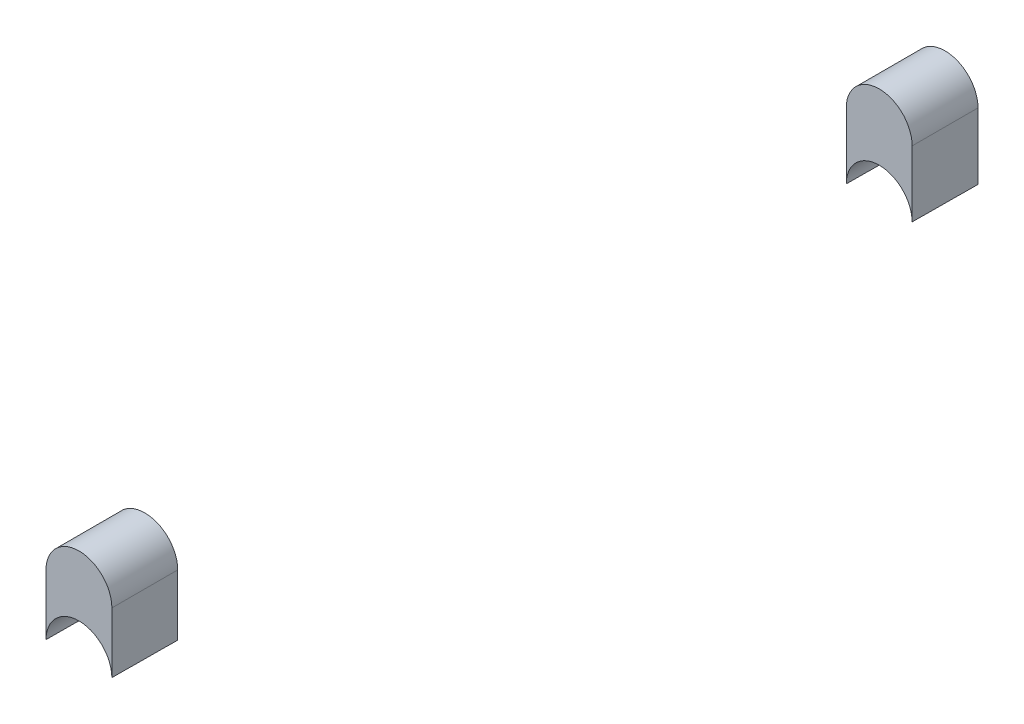
ISO-10303-21;
HEADER;
FILE_DESCRIPTION(('STEP AP214'),'2;1');
FILE_NAME('part.step','',(''),(''),'','','');
FILE_SCHEMA(('AUTOMOTIVE_DESIGN { 1 0 10303 214 1 1 1 1 }'));
ENDSEC;
DATA;
#1=APPLICATION_CONTEXT('core data for automotive mechanical design processes');
#2=APPLICATION_PROTOCOL_DEFINITION('international standard','automotive_design',2000,#1);
#3=PRODUCT_CONTEXT('',#1,'mechanical');
#4=PRODUCT('Part','Part','',(#3));
#5=PRODUCT_RELATED_PRODUCT_CATEGORY('part','',(#4));
#6=PRODUCT_DEFINITION_FORMATION('','',#4);
#7=PRODUCT_DEFINITION_CONTEXT('part definition',#1,'design');
#8=PRODUCT_DEFINITION('design','',#6,#7);
#9=PRODUCT_DEFINITION_SHAPE('','',#8);
#10=(LENGTH_UNIT() NAMED_UNIT(*) SI_UNIT(.MILLI.,.METRE.));
#11=(NAMED_UNIT(*) PLANE_ANGLE_UNIT() SI_UNIT($,.RADIAN.));
#12=(NAMED_UNIT(*) SI_UNIT($,.STERADIAN.) SOLID_ANGLE_UNIT());
#13=UNCERTAINTY_MEASURE_WITH_UNIT(LENGTH_MEASURE(1.E-05),#10,'distance_accuracy_value','');
#14=(GEOMETRIC_REPRESENTATION_CONTEXT(3) GLOBAL_UNCERTAINTY_ASSIGNED_CONTEXT((#13)) GLOBAL_UNIT_ASSIGNED_CONTEXT((#10,
#11,#12)) REPRESENTATION_CONTEXT('',''));
#15=CARTESIAN_POINT('',(0.,0.,0.));
#16=DIRECTION('',(0.,0.,1.));
#17=DIRECTION('',(1.,0.,0.));
#18=AXIS2_PLACEMENT_3D('',#15,#16,#17);
#19=CARTESIAN_POINT('',(0.,50.,-65.75));
#20=DIRECTION('',(0.,0.,1.));
#21=DIRECTION('',(1.,0.,0.));
#22=AXIS2_PLACEMENT_3D('',#19,#20,#21);
#23=CYLINDRICAL_SURFACE('',#22,5.);
#24=CARTESIAN_POINT('',(0.,50.,55.75));
#25=DIRECTION('',(0.,0.,1.));
#26=DIRECTION('',(1.,0.,0.));
#27=AXIS2_PLACEMENT_3D('',#24,#25,#26);
#28=CIRCLE('',#27,5.);
#29=CARTESIAN_POINT('',(-5.,50.,55.75));
#30=VERTEX_POINT('',#29);
#31=CARTESIAN_POINT('',(5.,50.,55.75));
#32=VERTEX_POINT('',#31);
#33=EDGE_CURVE('E52',#30,#32,#28,.F.);
#34=ORIENTED_EDGE('',*,*,#33,.F.);
#35=DIRECTION('',(0.,0.,1.));
#36=VECTOR('',#35,1.);
#37=CARTESIAN_POINT('',(-5.,50.,-65.75));
#38=LINE('',#37,#36);
#39=CARTESIAN_POINT('',(-5.,50.,65.75));
#40=VERTEX_POINT('',#39);
#41=EDGE_CURVE('E94',#30,#40,#38,.T.);
#42=ORIENTED_EDGE('',*,*,#41,.T.);
#43=CARTESIAN_POINT('',(0.,50.,65.75));
#44=DIRECTION('',(0.,0.,1.));
#45=DIRECTION('',(1.,0.,0.));
#46=AXIS2_PLACEMENT_3D('',#43,#44,#45);
#47=CIRCLE('',#46,5.);
#48=CARTESIAN_POINT('',(5.,50.,65.75));
#49=VERTEX_POINT('',#48);
#50=EDGE_CURVE('E83',#49,#40,#47,.T.);
#51=ORIENTED_EDGE('',*,*,#50,.F.);
#52=DIRECTION('',(0.,0.,1.));
#53=VECTOR('',#52,1.);
#54=CARTESIAN_POINT('',(5.,50.,-65.75));
#55=LINE('',#54,#53);
#56=EDGE_CURVE('E89',#32,#49,#55,.T.);
#57=ORIENTED_EDGE('',*,*,#56,.F.);
#58=EDGE_LOOP('',(#34,#42,#51,#57));
#59=FACE_BOUND('',#58,.T.);
#60=ADVANCED_FACE('F43',(#59),#23,.T.);
#61=CARTESIAN_POINT('',(5.,0.,-65.75));
#62=DIRECTION('',(1.,0.,0.));
#63=DIRECTION('',(0.,0.,-1.));
#64=AXIS2_PLACEMENT_3D('',#61,#62,#63);
#65=PLANE('',#64);
#66=DIRECTION('',(0.,-1.,0.));
#67=VECTOR('',#66,1.);
#68=CARTESIAN_POINT('',(5.,55.,55.75));
#69=LINE('',#68,#67);
#70=CARTESIAN_POINT('',(5.,40.7656623645698,55.75));
#71=VERTEX_POINT('',#70);
#72=EDGE_CURVE('E12',#32,#71,#69,.T.);
#73=ORIENTED_EDGE('',*,*,#72,.F.);
#74=ORIENTED_EDGE('',*,*,#56,.T.);
#75=DIRECTION('',(0.,1.,0.));
#76=VECTOR('',#75,1.);
#77=CARTESIAN_POINT('',(5.,0.,65.75));
#78=LINE('',#77,#76);
#79=CARTESIAN_POINT('',(5.,40.8341034292086,65.75));
#80=VERTEX_POINT('',#79);
#81=EDGE_CURVE('E106',#80,#49,#78,.T.);
#82=ORIENTED_EDGE('',*,*,#81,.F.);
#83=DIRECTION('',(0.,0.00684394617439934,0.999976579926131));
#84=VECTOR('',#83,1.);
#85=CARTESIAN_POINT('',(5.,39.9296583512409,-66.3994752808352));
#86=LINE('',#85,#84);
#87=EDGE_CURVE('E91',#71,#80,#86,.T.);
#88=ORIENTED_EDGE('',*,*,#87,.F.);
#89=EDGE_LOOP('',(#73,#74,#82,#88));
#90=FACE_BOUND('',#89,.T.);
#91=ADVANCED_FACE('F87',(#90),#65,.T.);
#92=CARTESIAN_POINT('',(-5.,0.,-65.75));
#93=DIRECTION('',(1.,0.,0.));
#94=DIRECTION('',(0.,0.,-1.));
#95=AXIS2_PLACEMENT_3D('',#92,#93,#94);
#96=PLANE('',#95);
#97=ORIENTED_EDGE('',*,*,#41,.F.);
#98=DIRECTION('',(0.,-1.,0.));
#99=VECTOR('',#98,1.);
#100=CARTESIAN_POINT('',(-5.,55.,55.75));
#101=LINE('',#100,#99);
#102=CARTESIAN_POINT('',(-5.,40.7656623645698,55.75));
#103=VERTEX_POINT('',#102);
#104=EDGE_CURVE('E60',#30,#103,#101,.T.);
#105=ORIENTED_EDGE('',*,*,#104,.T.);
#106=DIRECTION('',(0.,0.00684394617439934,0.999976579926131));
#107=VECTOR('',#106,1.);
#108=CARTESIAN_POINT('',(-5.,39.9296583512409,-66.3994752808352));
#109=LINE('',#108,#107);
#110=CARTESIAN_POINT('',(-5.,40.8341034292086,65.75));
#111=VERTEX_POINT('',#110);
#112=EDGE_CURVE('E96',#103,#111,#109,.T.);
#113=ORIENTED_EDGE('',*,*,#112,.T.);
#114=DIRECTION('',(0.,1.,0.));
#115=VECTOR('',#114,1.);
#116=CARTESIAN_POINT('',(-5.,0.,65.75));
#117=LINE('',#116,#115);
#118=EDGE_CURVE('E100',#111,#40,#117,.T.);
#119=ORIENTED_EDGE('',*,*,#118,.T.);
#120=EDGE_LOOP('',(#97,#105,#113,#119));
#121=FACE_BOUND('',#120,.T.);
#122=ADVANCED_FACE('F131',(#121),#96,.F.);
#123=CARTESIAN_POINT('',(0.,39.8954378189204,-66.3994752808352));
#124=DIRECTION('',(0.,0.,1.));
#125=DIRECTION('',(1.,0.,0.));
#126=AXIS2_PLACEMENT_3D('',#123,#124,#125);
#127=CIRCLE('',#126,5.00011710311191);
#128=DIRECTION('',(0.,0.00684394617439934,0.999976579926131));
#129=VECTOR('',#128,1.);
#130=SURFACE_OF_LINEAR_EXTRUSION('',#127,#129);
#131=ORIENTED_EDGE('',*,*,#112,.F.);
#132=CARTESIAN_POINT('',(-5.,40.7656623645698,55.75));
#133=CARTESIAN_POINT('',(-4.9990659214722,40.90422313923,55.75));
#134=CARTESIAN_POINT('',(-4.99234424224133,41.0427422421989,55.75));
#135=CARTESIAN_POINT('',(-4.96743511855729,41.3187399238017,55.75));
#136=CARTESIAN_POINT('',(-4.94924817199472,41.4562185473572,55.75));
#137=CARTESIAN_POINT('',(-4.90151719276049,41.7291940453299,55.75));
#138=CARTESIAN_POINT('',(-4.87197284743892,41.8646908650849,55.75));
#139=CARTESIAN_POINT('',(-4.80173606304755,42.1327618149604,55.75));
#140=CARTESIAN_POINT('',(-4.76104375369362,42.2653359790691,55.75));
#141=CARTESIAN_POINT('',(-4.66879879488905,42.5266246879324,55.75));
#142=CARTESIAN_POINT('',(-4.61724803275025,42.6553398989777,55.75));
#143=CARTESIAN_POINT('',(-4.50361775450178,42.9080914694971,55.75));
#144=CARTESIAN_POINT('',(-4.44153446487639,43.0321261325215,55.75));
#145=CARTESIAN_POINT('',(-4.30730503320032,43.2745671503083,55.75));
#146=CARTESIAN_POINT('',(-4.23516251007233,43.3929755087475,55.75));
#147=CARTESIAN_POINT('',(-4.08126821598817,43.6234353376785,55.75));
#148=CARTESIAN_POINT('',(-3.99951300556095,43.735484511428,55.75));
#149=CARTESIAN_POINT('',(-3.82701001566915,43.9523667497681,55.75));
#150=CARTESIAN_POINT('',(-3.73626547292308,44.0572023888056,55.75));
#151=CARTESIAN_POINT('',(-3.54635174905376,44.2590140838937,55.75));
#152=CARTESIAN_POINT('',(-3.4471795561682,44.3559873057802,55.75));
#153=CARTESIAN_POINT('',(-3.24116085816156,44.5413288645576,55.75));
#154=CARTESIAN_POINT('',(-3.13431711901114,44.6297002760228,55.75));
#155=CARTESIAN_POINT('',(-2.9136221292982,44.7972975909929,55.75));
#156=CARTESIAN_POINT('',(-2.79976837758602,44.8765202009032,55.75));
#157=CARTESIAN_POINT('',(-2.5659159322613,45.0252091233694,55.75));
#158=CARTESIAN_POINT('',(-2.44591945859175,45.0946789270345,55.75));
#159=CARTESIAN_POINT('',(-2.20053149467532,45.223439218985,55.75));
#160=CARTESIAN_POINT('',(-2.07513808242402,45.2827260426735,55.75));
#161=CARTESIAN_POINT('',(-1.81989756698354,45.3906614884924,55.75));
#162=CARTESIAN_POINT('',(-1.69005208953266,45.4393139470514,55.75));
#163=CARTESIAN_POINT('',(-1.42675633603487,45.525684715586,55.75));
#164=CARTESIAN_POINT('',(-1.29330476558279,45.5633990407649,55.75));
#165=CARTESIAN_POINT('',(-0.889033849888148,45.6596637549183,55.75));
#166=CARTESIAN_POINT('',(-0.614028030089566,45.7014498687076,55.75));
#167=CARTESIAN_POINT('',(-0.0608942034347574,45.7388665396397,55.75));
#168=CARTESIAN_POINT('',(0.217233803421469,45.7344970967824,55.75));
#169=CARTESIAN_POINT('',(0.630786129180449,45.6935539370732,55.75));
#170=CARTESIAN_POINT('',(0.76810108009217,45.6741555805462,55.75));
#171=CARTESIAN_POINT('',(1.0406300712354,45.62403061218,55.75));
#172=CARTESIAN_POINT('',(1.17584485743351,45.5933081231582,55.75));
#173=CARTESIAN_POINT('',(1.44329618442773,45.5207301039245,55.75));
#174=CARTESIAN_POINT('',(1.5755316309613,45.4788705532897,55.75));
#175=CARTESIAN_POINT('',(1.83602471815382,45.3843305239693,55.75));
#176=CARTESIAN_POINT('',(1.96428376978371,45.3316539353395,55.75));
#177=CARTESIAN_POINT('',(2.2160302854055,45.2158132959726,55.75));
#178=CARTESIAN_POINT('',(2.33951601983716,45.1526454869609,55.75));
#179=CARTESIAN_POINT('',(2.5807714035909,45.016296749178,55.75));
#180=CARTESIAN_POINT('',(2.69854308771906,44.9431194208386,55.75));
#181=CARTESIAN_POINT('',(2.92764556040675,44.7872115811117,55.75));
#182=CARTESIAN_POINT('',(3.0389740222376,44.7044776506274,55.75));
#183=CARTESIAN_POINT('',(3.25433632747398,44.5300808027445,55.75));
#184=CARTESIAN_POINT('',(3.35837277355956,44.4384210993475,55.75));
#185=CARTESIAN_POINT('',(3.55851256384403,44.2467462352238,55.75));
#186=CARTESIAN_POINT('',(3.6546130471101,44.1467280871764,55.75));
#187=CARTESIAN_POINT('',(3.83814220263189,43.9390932147502,55.75));
#188=CARTESIAN_POINT('',(3.92557397455464,43.8314792301453,55.75));
#189=CARTESIAN_POINT('',(4.09123048465514,43.6093246784308,55.75));
#190=CARTESIAN_POINT('',(4.16945195932058,43.4947816777738,55.75));
#191=CARTESIAN_POINT('',(4.31608612077523,43.259635570955,55.75));
#192=CARTESIAN_POINT('',(4.38450220595465,43.1390345840597,55.75));
#193=CARTESIAN_POINT('',(4.51108789659285,42.8925645352332,55.75));
#194=CARTESIAN_POINT('',(4.56925706994075,42.7666952514154,55.75));
#195=CARTESIAN_POINT('',(4.67495867604673,42.5105244524828,55.75));
#196=CARTESIAN_POINT('',(4.7224883050087,42.380221779452,55.75));
#197=CARTESIAN_POINT('',(4.80255260336027,42.1287173324021,55.75));
#198=CARTESIAN_POINT('',(4.83608468138923,42.0078318153861,55.75));
#199=CARTESIAN_POINT('',(4.89398078382619,41.7638416238205,55.75));
#200=CARTESIAN_POINT('',(4.91834190837384,41.6407362602266,55.75));
#201=CARTESIAN_POINT('',(4.95779576397235,41.3926851944457,55.75));
#202=CARTESIAN_POINT('',(4.97286152460385,41.267735204113,55.75));
#203=CARTESIAN_POINT('',(4.99353693399802,41.0170888056816,55.75));
#204=CARTESIAN_POINT('',(4.9991490838442,40.8913926038375,55.75));
#205=CARTESIAN_POINT('',(5.,40.7656623645699,55.75));
#206=B_SPLINE_CURVE_WITH_KNOTS('',3,(#132,#133,#134,#135,#136,#137,#138,#139,#140,#141,#142,
#143,#144,#145,#146,#147,#148,#149,#150,#151,#152,#153,#154,#155,#156,#157,#158,#159,#160,#161,
#162,#163,#164,#165,#166,#167,#168,#169,#170,#171,#172,#173,#174,#175,#176,#177,#178,#179,#180,
#181,#182,#183,#184,#185,#186,#187,#188,#189,#190,#191,#192,#193,#194,#195,#196,#197,#198,#199,
#200,#201,#202,#203,#204,#205),.UNSPECIFIED.,.F.,.F.,(4,2,2,2,2,2,2,2,2,2,2,2,2,2,2,2,2,2,2,2,2,
2,2,2,2,2,2,2,2,2,2,2,2,2,2,2,4),(0.,0.415568605254976,0.831119165274665,1.24668116551515,
1.66223833054964,2.07772332694684,2.49335749580149,2.90884251953935,3.32447666105335,
3.73996168866002,4.15559582630521,4.57108085265299,4.98671499155708,5.4021999688522,
5.81783415680892,6.23331815315782,6.64895332206014,7.4793545820181,8.30975584197606,
8.7253910108785,9.14087500722728,9.55650919518725,9.97199417247911,10.3876283114495,
10.803113337731,11.2187474765693,11.6342325029828,12.049866664702,12.4653516682347,
12.8809834515902,13.296470833488,13.7119757322398,14.1275899987505,14.5035922091133,
14.8797132119116,15.2569204567193,15.6340278904497),.UNSPECIFIED.);
#207=EDGE_CURVE('E102',#103,#71,#206,.T.);
#208=ORIENTED_EDGE('',*,*,#207,.T.);
#209=ORIENTED_EDGE('',*,*,#87,.T.);
#210=CARTESIAN_POINT('',(0.,40.7998828968881,65.75));
#211=DIRECTION('',(0.,0.,1.));
#212=DIRECTION('',(1.,0.,0.));
#213=AXIS2_PLACEMENT_3D('',#210,#211,#212);
#214=CIRCLE('',#213,5.00011710311191);
#215=EDGE_CURVE('E101',#80,#111,#214,.T.);
#216=ORIENTED_EDGE('',*,*,#215,.T.);
#217=EDGE_LOOP('',(#131,#208,#209,#216));
#218=FACE_BOUND('',#217,.T.);
#219=ADVANCED_FACE('F119',(#218),#130,.F.);
#220=CARTESIAN_POINT('',(0.,0.,65.75));
#221=DIRECTION('',(0.,0.,1.));
#222=DIRECTION('',(1.,0.,0.));
#223=AXIS2_PLACEMENT_3D('',#220,#221,#222);
#224=PLANE('',#223);
#225=ORIENTED_EDGE('',*,*,#215,.F.);
#226=ORIENTED_EDGE('',*,*,#81,.T.);
#227=ORIENTED_EDGE('',*,*,#50,.T.);
#228=ORIENTED_EDGE('',*,*,#118,.F.);
#229=EDGE_LOOP('',(#225,#226,#227,#228));
#230=FACE_BOUND('',#229,.T.);
#231=ADVANCED_FACE('F125',(#230),#224,.T.);
#232=CARTESIAN_POINT('',(-5.,55.,55.75));
#233=DIRECTION('',(0.,0.,1.));
#234=DIRECTION('',(1.,0.,0.));
#235=AXIS2_PLACEMENT_3D('',#232,#233,#234);
#236=PLANE('',#235);
#237=ORIENTED_EDGE('',*,*,#33,.T.);
#238=ORIENTED_EDGE('',*,*,#72,.T.);
#239=ORIENTED_EDGE('',*,*,#207,.F.);
#240=ORIENTED_EDGE('',*,*,#104,.F.);
#241=EDGE_LOOP('',(#237,#238,#239,#240));
#242=FACE_BOUND('',#241,.T.);
#243=ADVANCED_FACE('F79',(#242),#236,.F.);
#244=CLOSED_SHELL('',(#60,#91,#122,#219,#231,#243));
#245=MANIFOLD_SOLID_BREP('B2',#244);
#246=CARTESIAN_POINT('',(0.,0.,-65.75));
#247=DIRECTION('',(0.,0.,1.));
#248=DIRECTION('',(1.,0.,0.));
#249=AXIS2_PLACEMENT_3D('',#246,#247,#248);
#250=PLANE('',#249);
#251=DIRECTION('',(0.,1.,0.));
#252=VECTOR('',#251,1.);
#253=CARTESIAN_POINT('',(5.,0.,-65.75));
#254=LINE('',#253,#252);
#255=CARTESIAN_POINT('',(5.,39.9341034292086,-65.75));
#256=VERTEX_POINT('',#255);
#257=CARTESIAN_POINT('',(5.,50.,-65.75));
#258=VERTEX_POINT('',#257);
#259=EDGE_CURVE('E215',#256,#258,#254,.T.);
#260=ORIENTED_EDGE('',*,*,#259,.F.);
#261=CARTESIAN_POINT('',(5.,39.9341034292086,-65.75));
#262=CARTESIAN_POINT('',(4.9990659214722,40.0726642038689,-65.75));
#263=CARTESIAN_POINT('',(4.99234424224133,40.2111833068377,-65.75));
#264=CARTESIAN_POINT('',(4.96743511855729,40.4871809884405,-65.75));
#265=CARTESIAN_POINT('',(4.94924817199471,40.624659611996,-65.75));
#266=CARTESIAN_POINT('',(4.90151719276048,40.8976351099687,-65.75));
#267=CARTESIAN_POINT('',(4.87197284743891,41.0331319297237,-65.75));
#268=CARTESIAN_POINT('',(4.80173606304753,41.3012028795993,-65.75));
#269=CARTESIAN_POINT('',(4.7610437536936,41.433777043708,-65.75));
#270=CARTESIAN_POINT('',(4.66879879488904,41.6950657525713,-65.75));
#271=CARTESIAN_POINT('',(4.61724803275023,41.8237809636165,-65.75));
#272=CARTESIAN_POINT('',(4.50361775450176,42.076532534136,-65.75));
#273=CARTESIAN_POINT('',(4.44153446487637,42.2005671971603,-65.75));
#274=CARTESIAN_POINT('',(4.30730503320029,42.4430082149471,-65.75));
#275=CARTESIAN_POINT('',(4.2351625100723,42.5614165733863,-65.75));
#276=CARTESIAN_POINT('',(4.08126821598814,42.7918764023173,-65.75));
#277=CARTESIAN_POINT('',(3.99951300556092,42.9039255760668,-65.75));
#278=CARTESIAN_POINT('',(3.82701001566912,43.1208078144069,-65.75));
#279=CARTESIAN_POINT('',(3.73626547292304,43.2256434534444,-65.75));
#280=CARTESIAN_POINT('',(3.54635174905373,43.4274551485325,-65.75));
#281=CARTESIAN_POINT('',(3.44717955616816,43.524428370419,-65.75));
#282=CARTESIAN_POINT('',(3.24116085816152,43.7097699291965,-65.75));
#283=CARTESIAN_POINT('',(3.13431711901111,43.7981413406617,-65.75));
#284=CARTESIAN_POINT('',(2.91362212929817,43.9657386556318,-65.75));
#285=CARTESIAN_POINT('',(2.79976837758598,44.0449612655421,-65.75));
#286=CARTESIAN_POINT('',(2.56591593226126,44.1936501880082,-65.75));
#287=CARTESIAN_POINT('',(2.4459194585917,44.2631199916733,-65.75));
#288=CARTESIAN_POINT('',(2.20053149467527,44.3918802836238,-65.75));
#289=CARTESIAN_POINT('',(2.07513808242398,44.4511671073123,-65.75));
#290=CARTESIAN_POINT('',(1.81989756698349,44.5591025531312,-65.75));
#291=CARTESIAN_POINT('',(1.69005208953262,44.6077550116902,-65.75));
#292=CARTESIAN_POINT('',(1.42675633603482,44.6941257802248,-65.75));
#293=CARTESIAN_POINT('',(1.29330476558274,44.7318401054037,-65.75));
#294=CARTESIAN_POINT('',(0.889033849888103,44.8281048195571,-65.75));
#295=CARTESIAN_POINT('',(0.61402803008952,44.8698909333464,-65.75));
#296=CARTESIAN_POINT('',(0.0608942034347118,44.9073076042785,-65.75));
#297=CARTESIAN_POINT('',(-0.217233803421513,44.9029381614212,-65.75));
#298=CARTESIAN_POINT('',(-0.630786129180492,44.861995001712,-65.75));
#299=CARTESIAN_POINT('',(-0.768101080092213,44.842596645185,-65.75));
#300=CARTESIAN_POINT('',(-1.04063007123544,44.7924716768188,-65.75));
#301=CARTESIAN_POINT('',(-1.17584485743355,44.761749187797,-65.75));
#302=CARTESIAN_POINT('',(-1.44329618442777,44.6891711685632,-65.75));
#303=CARTESIAN_POINT('',(-1.57553163096134,44.6473116179284,-65.75));
#304=CARTESIAN_POINT('',(-1.83602471815385,44.5527715886081,-65.75));
#305=CARTESIAN_POINT('',(-1.96428376978375,44.5000949999783,-65.75));
#306=CARTESIAN_POINT('',(-2.21603028540553,44.3842543606113,-65.75));
#307=CARTESIAN_POINT('',(-2.3395160198372,44.3210865515997,-65.75));
#308=CARTESIAN_POINT('',(-2.58077140359093,44.1847378138168,-65.75));
#309=CARTESIAN_POINT('',(-2.69854308771909,44.1115604854774,-65.75));
#310=CARTESIAN_POINT('',(-2.92764556040678,43.9556526457504,-65.75));
#311=CARTESIAN_POINT('',(-3.03897402223763,43.8729187152661,-65.75));
#312=CARTESIAN_POINT('',(-3.254336327474,43.6985218673832,-65.75));
#313=CARTESIAN_POINT('',(-3.35837277355958,43.6068621639862,-65.75));
#314=CARTESIAN_POINT('',(-3.55851256384406,43.4151872998626,-65.75));
#315=CARTESIAN_POINT('',(-3.65461304711013,43.3151691518152,-65.75));
#316=CARTESIAN_POINT('',(-3.83814220263191,43.107534279389,-65.75));
#317=CARTESIAN_POINT('',(-3.92557397455466,42.9999202947841,-65.75));
#318=CARTESIAN_POINT('',(-4.09123048465516,42.7777657430696,-65.75));
#319=CARTESIAN_POINT('',(-4.1694519593206,42.6632227424126,-65.75));
#320=CARTESIAN_POINT('',(-4.31608612077525,42.4280766355938,-65.75));
#321=CARTESIAN_POINT('',(-4.38450220595467,42.3074756486985,-65.75));
#322=CARTESIAN_POINT('',(-4.51108789659286,42.0610055998719,-65.75));
#323=CARTESIAN_POINT('',(-4.56925706994076,41.9351363160542,-65.75));
#324=CARTESIAN_POINT('',(-4.67495867604674,41.6789655171216,-65.75));
#325=CARTESIAN_POINT('',(-4.72248830500871,41.5486628440908,-65.75));
#326=CARTESIAN_POINT('',(-4.80255260336027,41.2971583970409,-65.75));
#327=CARTESIAN_POINT('',(-4.83608468138922,41.1762728800249,-65.75));
#328=CARTESIAN_POINT('',(-4.89398078382618,40.9322826884594,-65.75));
#329=CARTESIAN_POINT('',(-4.91834190837383,40.8091773248654,-65.75));
#330=CARTESIAN_POINT('',(-4.95779576397233,40.5611262590846,-65.75));
#331=CARTESIAN_POINT('',(-4.97286152460383,40.436176268752,-65.75));
#332=CARTESIAN_POINT('',(-4.99353693399801,40.1855298703206,-65.75));
#333=CARTESIAN_POINT('',(-4.99914908384419,40.0598336684765,-65.75));
#334=CARTESIAN_POINT('',(-4.99999999999999,39.9341034292089,-65.75));
#335=B_SPLINE_CURVE_WITH_KNOTS('',3,(#261,#262,#263,#264,#265,#266,#267,#268,#269,#270,#271,
#272,#273,#274,#275,#276,#277,#278,#279,#280,#281,#282,#283,#284,#285,#286,#287,#288,#289,#290,
#291,#292,#293,#294,#295,#296,#297,#298,#299,#300,#301,#302,#303,#304,#305,#306,#307,#308,#309,
#310,#311,#312,#313,#314,#315,#316,#317,#318,#319,#320,#321,#322,#323,#324,#325,#326,#327,#328,
#329,#330,#331,#332,#333,#334),.UNSPECIFIED.,.F.,.F.,(4,2,2,2,2,2,2,2,2,2,2,2,2,2,2,2,2,2,2,2,2,
2,2,2,2,2,2,2,2,2,2,2,2,2,2,2,4),(0.,0.415568605254969,0.831119165274665,1.24668116551516,
1.66223833054965,2.07772332694684,2.4933574958015,2.90884251953935,3.32447666105335,
3.73996168866002,4.15559582630522,4.57108085265299,4.98671499155708,5.4021999688522,
5.81783415680892,6.23331815315782,6.64895332206014,7.47935458201809,8.30975584197605,
8.72539101087849,9.14087500722727,9.55650919518724,9.9719941724791,10.3876283114495,
10.803113337731,11.2187474765693,11.6342325029828,12.0498666647019,12.4653516682347,
12.8809834515902,13.296470833488,13.7119757322398,14.1275899987505,14.5035922091132,
14.8797132119114,15.2569204567191,15.6340278904493),.UNSPECIFIED.);
#336=CARTESIAN_POINT('',(-5.,39.9341034292086,-65.75));
#337=VERTEX_POINT('',#336);
#338=EDGE_CURVE('E244',#256,#337,#335,.T.);
#339=ORIENTED_EDGE('',*,*,#338,.T.);
#340=DIRECTION('',(0.,1.,0.));
#341=VECTOR('',#340,1.);
#342=CARTESIAN_POINT('',(-5.,0.,-65.75));
#343=LINE('',#342,#341);
#344=CARTESIAN_POINT('',(-5.,50.,-65.75));
#345=VERTEX_POINT('',#344);
#346=EDGE_CURVE('E278',#337,#345,#343,.T.);
#347=ORIENTED_EDGE('',*,*,#346,.T.);
#348=CARTESIAN_POINT('',(0.,50.,-65.75));
#349=DIRECTION('',(0.,0.,1.));
#350=DIRECTION('',(1.,0.,0.));
#351=AXIS2_PLACEMENT_3D('',#348,#349,#350);
#352=CIRCLE('',#351,5.);
#353=EDGE_CURVE('E258',#258,#345,#352,.T.);
#354=ORIENTED_EDGE('',*,*,#353,.F.);
#355=EDGE_LOOP('',(#260,#339,#347,#354));
#356=FACE_BOUND('',#355,.T.);
#357=ADVANCED_FACE('F187',(#356),#250,.F.);
#358=CARTESIAN_POINT('',(0.,39.8954378189204,-66.3994752808352));
#359=DIRECTION('',(0.,0.,1.));
#360=DIRECTION('',(1.,0.,0.));
#361=AXIS2_PLACEMENT_3D('',#358,#359,#360);
#362=CIRCLE('',#361,5.00011710311191);
#363=DIRECTION('',(0.,0.00684394617439934,0.999976579926131));
#364=VECTOR('',#363,1.);
#365=SURFACE_OF_LINEAR_EXTRUSION('',#362,#364);
#366=DIRECTION('',(0.,0.00684394617439934,0.999976579926131));
#367=VECTOR('',#366,1.);
#368=CARTESIAN_POINT('',(5.,39.9296583512409,-66.3994752808352));
#369=LINE('',#368,#367);
#370=CARTESIAN_POINT('',(5.,40.0025444938474,-55.75));
#371=VERTEX_POINT('',#370);
#372=EDGE_CURVE('E240',#256,#371,#369,.T.);
#373=ORIENTED_EDGE('',*,*,#372,.T.);
#374=CARTESIAN_POINT('',(5.,40.0025444938474,-55.75));
#375=CARTESIAN_POINT('',(4.99906592147221,40.1411052685076,-55.75));
#376=CARTESIAN_POINT('',(4.99234424224133,40.2796243714765,-55.75));
#377=CARTESIAN_POINT('',(4.96743511855729,40.5556220530793,-55.75));
#378=CARTESIAN_POINT('',(4.94924817199472,40.6931006766347,-55.75));
#379=CARTESIAN_POINT('',(4.90151719276049,40.9660761746075,-55.75));
#380=CARTESIAN_POINT('',(4.87197284743892,41.1015729943625,-55.75));
#381=CARTESIAN_POINT('',(4.80173606304755,41.369643944238,-55.75));
#382=CARTESIAN_POINT('',(4.76104375369362,41.5022181083467,-55.75));
#383=CARTESIAN_POINT('',(4.66879879488905,41.76350681721,-55.75));
#384=CARTESIAN_POINT('',(4.61724803275025,41.8922220282552,-55.75));
#385=CARTESIAN_POINT('',(4.50361775450178,42.1449735987747,-55.75));
#386=CARTESIAN_POINT('',(4.44153446487639,42.269008261799,-55.75));
#387=CARTESIAN_POINT('',(4.30730503320032,42.5114492795858,-55.75));
#388=CARTESIAN_POINT('',(4.23516251007233,42.629857638025,-55.75));
#389=CARTESIAN_POINT('',(4.08126821598817,42.860317466956,-55.75));
#390=CARTESIAN_POINT('',(3.99951300556096,42.9723666407056,-55.75));
#391=CARTESIAN_POINT('',(3.82701001566915,43.1892488790457,-55.75));
#392=CARTESIAN_POINT('',(3.73626547292308,43.2940845180831,-55.75));
#393=CARTESIAN_POINT('',(3.54635174905377,43.4958962131712,-55.75));
#394=CARTESIAN_POINT('',(3.44717955616821,43.5928694350578,-55.75));
#395=CARTESIAN_POINT('',(3.24116085816157,43.7782109938352,-55.75));
#396=CARTESIAN_POINT('',(3.13431711901115,43.8665824053004,-55.75));
#397=CARTESIAN_POINT('',(2.91362212929822,44.0341797202705,-55.75));
#398=CARTESIAN_POINT('',(2.79976837758604,44.1134023301808,-55.75));
#399=CARTESIAN_POINT('',(2.56591593226132,44.262091252647,-55.75));
#400=CARTESIAN_POINT('',(2.44591945859176,44.3315610563121,-55.75));
#401=CARTESIAN_POINT('',(2.20053149467533,44.4603213482625,-55.75));
#402=CARTESIAN_POINT('',(2.07513808242404,44.5196081719511,-55.75));
#403=CARTESIAN_POINT('',(1.81989756698356,44.6275436177699,-55.75));
#404=CARTESIAN_POINT('',(1.69005208953268,44.676196076329,-55.75));
#405=CARTESIAN_POINT('',(1.4267563360349,44.7625668448636,-55.75));
#406=CARTESIAN_POINT('',(1.29330476558282,44.8002811700425,-55.75));
#407=CARTESIAN_POINT('',(0.889033849888179,44.8965458841959,-55.75));
#408=CARTESIAN_POINT('',(0.6140280300896,44.9383319979852,-55.75));
#409=CARTESIAN_POINT('',(0.0608942034347956,44.9757486689172,-55.75));
#410=CARTESIAN_POINT('',(-0.217233803421429,44.97137922606,-55.75));
#411=CARTESIAN_POINT('',(-0.630786129180407,44.9304360663507,-55.75));
#412=CARTESIAN_POINT('',(-0.768101080092128,44.9110377098238,-55.75));
#413=CARTESIAN_POINT('',(-1.04063007123536,44.8609127414576,-55.75));
#414=CARTESIAN_POINT('',(-1.17584485743347,44.8301902524358,-55.75));
#415=CARTESIAN_POINT('',(-1.44329618442769,44.7576122332021,-55.75));
#416=CARTESIAN_POINT('',(-1.57553163096125,44.7157526825672,-55.75));
#417=CARTESIAN_POINT('',(-1.83602471815377,44.6212126532469,-55.75));
#418=CARTESIAN_POINT('',(-1.96428376978366,44.5685360646171,-55.75));
#419=CARTESIAN_POINT('',(-2.21603028540545,44.4526954252502,-55.75));
#420=CARTESIAN_POINT('',(-2.33951601983712,44.3895276162385,-55.75));
#421=CARTESIAN_POINT('',(-2.58077140359085,44.2531788784556,-55.75));
#422=CARTESIAN_POINT('',(-2.69854308771901,44.1800015501162,-55.75));
#423=CARTESIAN_POINT('',(-2.9276455604067,44.0240937103893,-55.75));
#424=CARTESIAN_POINT('',(-3.03897402223755,43.941359779905,-55.75));
#425=CARTESIAN_POINT('',(-3.25433632747394,43.7669629320221,-55.75));
#426=CARTESIAN_POINT('',(-3.35837277355952,43.6753032286251,-55.75));
#427=CARTESIAN_POINT('',(-3.55851256384399,43.4836283645014,-55.75));
#428=CARTESIAN_POINT('',(-3.65461304711006,43.3836102164541,-55.75));
#429=CARTESIAN_POINT('',(-3.83814220263185,43.1759753440278,-55.75));
#430=CARTESIAN_POINT('',(-3.9255739745546,43.068361359423,-55.75));
#431=CARTESIAN_POINT('',(-4.0912304846551,42.8462068077084,-55.75));
#432=CARTESIAN_POINT('',(-4.16945195932054,42.7316638070515,-55.75));
#433=CARTESIAN_POINT('',(-4.3160861207752,42.4965177002326,-55.75));
#434=CARTESIAN_POINT('',(-4.38450220595462,42.3759167133373,-55.75));
#435=CARTESIAN_POINT('',(-4.51108789659281,42.1294466645108,-55.75));
#436=CARTESIAN_POINT('',(-4.56925706994072,42.0035773806931,-55.75));
#437=CARTESIAN_POINT('',(-4.6749586760467,41.7474065817605,-55.75));
#438=CARTESIAN_POINT('',(-4.72248830500867,41.6171039087296,-55.75));
#439=CARTESIAN_POINT('',(-4.80255260336024,41.3655994616798,-55.75));
#440=CARTESIAN_POINT('',(-4.8360846813892,41.2447139446638,-55.75));
#441=CARTESIAN_POINT('',(-4.89398078382617,41.0007237530982,-55.75));
#442=CARTESIAN_POINT('',(-4.91834190837382,40.8776183895042,-55.75));
#443=CARTESIAN_POINT('',(-4.95779576397233,40.6295673237234,-55.75));
#444=CARTESIAN_POINT('',(-4.97286152460383,40.5046173333908,-55.75));
#445=CARTESIAN_POINT('',(-4.99353693399801,40.2539709349593,-55.75));
#446=CARTESIAN_POINT('',(-4.9991490838442,40.1282747331152,-55.75));
#447=CARTESIAN_POINT('',(-4.99999999999999,40.0025444938477,-55.75));
#448=B_SPLINE_CURVE_WITH_KNOTS('',3,(#374,#375,#376,#377,#378,#379,#380,#381,#382,#383,#384,
#385,#386,#387,#388,#389,#390,#391,#392,#393,#394,#395,#396,#397,#398,#399,#400,#401,#402,#403,
#404,#405,#406,#407,#408,#409,#410,#411,#412,#413,#414,#415,#416,#417,#418,#419,#420,#421,#422,
#423,#424,#425,#426,#427,#428,#429,#430,#431,#432,#433,#434,#435,#436,#437,#438,#439,#440,#441,
#442,#443,#444,#445,#446,#447),.UNSPECIFIED.,.F.,.F.,(4,2,2,2,2,2,2,2,2,2,2,2,2,2,2,2,2,2,2,2,2,
2,2,2,2,2,2,2,2,2,2,2,2,2,2,2,4),(0.,0.415568605254976,0.831119165274665,1.24668116551516,
1.66223833054965,2.07772332694684,2.49335749580148,2.90884251953934,3.32447666105334,
3.73996168866001,4.1555958263052,4.57108085265297,4.98671499155707,5.40219996885218,
5.81783415680889,6.23331815315779,6.64895332206011,7.47935458201806,8.30975584197602,
8.72539101087846,9.14087500722723,9.5565091951872,9.97199417247906,10.3876283114495,
10.8031133377309,11.2187474765693,11.6342325029828,12.0498666647019,12.4653516682346,
12.8809834515902,13.2964708334879,13.7119757322398,14.1275899987505,14.5035922091132,
14.8797132119114,15.2569204567191,15.6340278904495),.UNSPECIFIED.);
#449=CARTESIAN_POINT('',(-5.,40.0025444938474,-55.75));
#450=VERTEX_POINT('',#449);
#451=EDGE_CURVE('E41',#371,#450,#448,.T.);
#452=ORIENTED_EDGE('',*,*,#451,.T.);
#453=DIRECTION('',(0.,0.00684394617439934,0.999976579926131));
#454=VECTOR('',#453,1.);
#455=CARTESIAN_POINT('',(-5.,39.9296583512409,-66.3994752808352));
#456=LINE('',#455,#454);
#457=EDGE_CURVE('E245',#337,#450,#456,.T.);
#458=ORIENTED_EDGE('',*,*,#457,.F.);
#459=ORIENTED_EDGE('',*,*,#338,.F.);
#460=EDGE_LOOP('',(#373,#452,#458,#459));
#461=FACE_BOUND('',#460,.T.);
#462=ADVANCED_FACE('F242',(#461),#365,.F.);
#463=CARTESIAN_POINT('',(-5.,0.,-65.75));
#464=DIRECTION('',(1.,0.,0.));
#465=DIRECTION('',(0.,0.,-1.));
#466=AXIS2_PLACEMENT_3D('',#463,#464,#465);
#467=PLANE('',#466);
#468=ORIENTED_EDGE('',*,*,#457,.T.);
#469=DIRECTION('',(0.,1.,0.));
#470=VECTOR('',#469,1.);
#471=CARTESIAN_POINT('',(-5.,55.,-55.75));
#472=LINE('',#471,#470);
#473=CARTESIAN_POINT('',(-5.,50.,-55.75));
#474=VERTEX_POINT('',#473);
#475=EDGE_CURVE('E208',#450,#474,#472,.T.);
#476=ORIENTED_EDGE('',*,*,#475,.T.);
#477=DIRECTION('',(0.,0.,1.));
#478=VECTOR('',#477,1.);
#479=CARTESIAN_POINT('',(-5.,50.,-65.75));
#480=LINE('',#479,#478);
#481=EDGE_CURVE('E273',#345,#474,#480,.T.);
#482=ORIENTED_EDGE('',*,*,#481,.F.);
#483=ORIENTED_EDGE('',*,*,#346,.F.);
#484=EDGE_LOOP('',(#468,#476,#482,#483));
#485=FACE_BOUND('',#484,.T.);
#486=ADVANCED_FACE('F264',(#485),#467,.F.);
#487=CARTESIAN_POINT('',(5.,0.,-65.75));
#488=DIRECTION('',(1.,0.,0.));
#489=DIRECTION('',(0.,0.,-1.));
#490=AXIS2_PLACEMENT_3D('',#487,#488,#489);
#491=PLANE('',#490);
#492=DIRECTION('',(0.,1.,0.));
#493=VECTOR('',#492,1.);
#494=CARTESIAN_POINT('',(5.,55.,-55.75));
#495=LINE('',#494,#493);
#496=CARTESIAN_POINT('',(5.,50.,-55.75));
#497=VERTEX_POINT('',#496);
#498=EDGE_CURVE('E234',#371,#497,#495,.T.);
#499=ORIENTED_EDGE('',*,*,#498,.F.);
#500=ORIENTED_EDGE('',*,*,#372,.F.);
#501=ORIENTED_EDGE('',*,*,#259,.T.);
#502=DIRECTION('',(0.,0.,1.));
#503=VECTOR('',#502,1.);
#504=CARTESIAN_POINT('',(5.,50.,-65.75));
#505=LINE('',#504,#503);
#506=EDGE_CURVE('E201',#258,#497,#505,.T.);
#507=ORIENTED_EDGE('',*,*,#506,.T.);
#508=EDGE_LOOP('',(#499,#500,#501,#507));
#509=FACE_BOUND('',#508,.T.);
#510=ADVANCED_FACE('F239',(#509),#491,.T.);
#511=CARTESIAN_POINT('',(0.,50.,-65.75));
#512=DIRECTION('',(0.,0.,1.));
#513=DIRECTION('',(1.,0.,0.));
#514=AXIS2_PLACEMENT_3D('',#511,#512,#513);
#515=CYLINDRICAL_SURFACE('',#514,5.);
#516=CARTESIAN_POINT('',(0.,50.,-55.75));
#517=DIRECTION('',(0.,0.,-1.));
#518=DIRECTION('',(-1.,0.,0.));
#519=AXIS2_PLACEMENT_3D('',#516,#517,#518);
#520=CIRCLE('',#519,5.);
#521=EDGE_CURVE('E246',#497,#474,#520,.F.);
#522=ORIENTED_EDGE('',*,*,#521,.F.);
#523=ORIENTED_EDGE('',*,*,#506,.F.);
#524=ORIENTED_EDGE('',*,*,#353,.T.);
#525=ORIENTED_EDGE('',*,*,#481,.T.);
#526=EDGE_LOOP('',(#522,#523,#524,#525));
#527=FACE_BOUND('',#526,.T.);
#528=ADVANCED_FACE('F189',(#527),#515,.T.);
#529=CARTESIAN_POINT('',(-5.,55.,-55.75));
#530=DIRECTION('',(0.,0.,-1.));
#531=DIRECTION('',(-1.,0.,0.));
#532=AXIS2_PLACEMENT_3D('',#529,#530,#531);
#533=PLANE('',#532);
#534=ORIENTED_EDGE('',*,*,#521,.T.);
#535=ORIENTED_EDGE('',*,*,#475,.F.);
#536=ORIENTED_EDGE('',*,*,#451,.F.);
#537=ORIENTED_EDGE('',*,*,#498,.T.);
#538=EDGE_LOOP('',(#534,#535,#536,#537));
#539=FACE_BOUND('',#538,.T.);
#540=ADVANCED_FACE('F233',(#539),#533,.F.);
#541=CLOSED_SHELL('',(#357,#462,#486,#510,#528,#540));
#542=MANIFOLD_SOLID_BREP('B6',#541);
#543=ADVANCED_BREP_SHAPE_REPRESENTATION('',(#18,#245,#542),#14);
#544=SHAPE_DEFINITION_REPRESENTATION(#9,#543);
ENDSEC;
END-ISO-10303-21;
